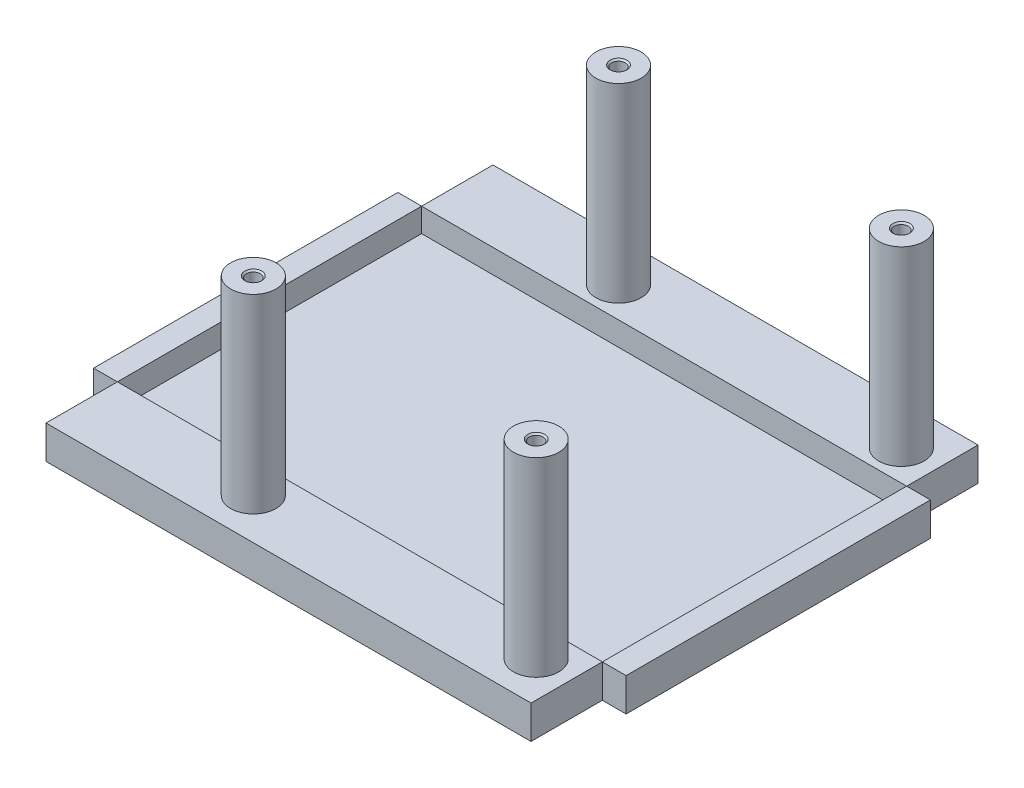
ISO-10303-21;
HEADER;
FILE_DESCRIPTION(('STEP AP214'),'2;1');
FILE_NAME('part.step','',(''),(''),'','','');
FILE_SCHEMA(('AUTOMOTIVE_DESIGN { 1 0 10303 214 1 1 1 1 }'));
ENDSEC;
DATA;
#1=APPLICATION_CONTEXT('core data for automotive mechanical design processes');
#2=APPLICATION_PROTOCOL_DEFINITION('international standard','automotive_design',2000,#1);
#3=PRODUCT_CONTEXT('',#1,'mechanical');
#4=PRODUCT('Part','Part','',(#3));
#5=PRODUCT_RELATED_PRODUCT_CATEGORY('part','',(#4));
#6=PRODUCT_DEFINITION_FORMATION('','',#4);
#7=PRODUCT_DEFINITION_CONTEXT('part definition',#1,'design');
#8=PRODUCT_DEFINITION('design','',#6,#7);
#9=PRODUCT_DEFINITION_SHAPE('','',#8);
#10=(LENGTH_UNIT() NAMED_UNIT(*) SI_UNIT(.MILLI.,.METRE.));
#11=(NAMED_UNIT(*) PLANE_ANGLE_UNIT() SI_UNIT($,.RADIAN.));
#12=(NAMED_UNIT(*) SI_UNIT($,.STERADIAN.) SOLID_ANGLE_UNIT());
#13=UNCERTAINTY_MEASURE_WITH_UNIT(LENGTH_MEASURE(1.E-05),#10,'distance_accuracy_value','');
#14=(GEOMETRIC_REPRESENTATION_CONTEXT(3) GLOBAL_UNCERTAINTY_ASSIGNED_CONTEXT((#13)) GLOBAL_UNIT_ASSIGNED_CONTEXT((#10,
#11,#12)) REPRESENTATION_CONTEXT('',''));
#15=CARTESIAN_POINT('',(0.,0.,0.));
#16=DIRECTION('',(0.,0.,1.));
#17=DIRECTION('',(1.,0.,0.));
#18=AXIS2_PLACEMENT_3D('',#15,#16,#17);
#19=CARTESIAN_POINT('',(0.,7.,-64.));
#20=DIRECTION('',(0.,0.,1.));
#21=DIRECTION('',(1.,0.,0.));
#22=AXIS2_PLACEMENT_3D('',#19,#20,#21);
#23=PLANE('',#22);
#24=DIRECTION('',(-1.,0.,0.));
#25=VECTOR('',#24,1.);
#26=CARTESIAN_POINT('',(0.,0.,-64.));
#27=LINE('',#26,#25);
#28=CARTESIAN_POINT('',(0.,0.,-64.));
#29=VERTEX_POINT('',#28);
#30=CARTESIAN_POINT('',(-5.00000000000001,0.,-64.));
#31=VERTEX_POINT('',#30);
#32=EDGE_CURVE('E247',#29,#31,#27,.T.);
#33=ORIENTED_EDGE('',*,*,#32,.T.);
#34=DIRECTION('',(0.,-1.,0.));
#35=VECTOR('',#34,1.);
#36=CARTESIAN_POINT('',(-5.00000000000001,7.,-64.));
#37=LINE('',#36,#35);
#38=CARTESIAN_POINT('',(-5.00000000000001,7.,-64.));
#39=VERTEX_POINT('',#38);
#40=EDGE_CURVE('E12',#39,#31,#37,.T.);
#41=ORIENTED_EDGE('',*,*,#40,.F.);
#42=DIRECTION('',(-1.,0.,0.));
#43=VECTOR('',#42,1.);
#44=CARTESIAN_POINT('',(0.,7.,-64.));
#45=LINE('',#44,#43);
#46=CARTESIAN_POINT('',(0.,7.,-64.));
#47=VERTEX_POINT('',#46);
#48=EDGE_CURVE('E274',#47,#39,#45,.T.);
#49=ORIENTED_EDGE('',*,*,#48,.F.);
#50=DIRECTION('',(0.,-1.,0.));
#51=VECTOR('',#50,1.);
#52=CARTESIAN_POINT('',(0.,7.,-64.));
#53=LINE('',#52,#51);
#54=EDGE_CURVE('E117',#47,#29,#53,.T.);
#55=ORIENTED_EDGE('',*,*,#54,.T.);
#56=EDGE_LOOP('',(#33,#41,#49,#55));
#57=FACE_BOUND('',#56,.T.);
#58=ADVANCED_FACE('F91',(#57),#23,.F.);
#59=CARTESIAN_POINT('',(-5.,7.,0.));
#60=DIRECTION('',(1.,0.,0.));
#61=DIRECTION('',(0.,0.,-1.));
#62=AXIS2_PLACEMENT_3D('',#59,#60,#61);
#63=PLANE('',#62);
#64=DIRECTION('',(0.,0.,1.));
#65=VECTOR('',#64,1.);
#66=CARTESIAN_POINT('',(-5.,0.,0.));
#67=LINE('',#66,#65);
#68=CARTESIAN_POINT('',(-5.,0.,0.));
#69=VERTEX_POINT('',#68);
#70=EDGE_CURVE('E275',#31,#69,#67,.T.);
#71=ORIENTED_EDGE('',*,*,#70,.T.);
#72=DIRECTION('',(0.,-1.,0.));
#73=VECTOR('',#72,1.);
#74=CARTESIAN_POINT('',(-5.,7.,0.));
#75=LINE('',#74,#73);
#76=CARTESIAN_POINT('',(-5.,7.,0.));
#77=VERTEX_POINT('',#76);
#78=EDGE_CURVE('E100',#77,#69,#75,.T.);
#79=ORIENTED_EDGE('',*,*,#78,.F.);
#80=DIRECTION('',(0.,0.,1.));
#81=VECTOR('',#80,1.);
#82=CARTESIAN_POINT('',(-5.,7.,0.));
#83=LINE('',#82,#81);
#84=EDGE_CURVE('E282',#39,#77,#83,.T.);
#85=ORIENTED_EDGE('',*,*,#84,.F.);
#86=ORIENTED_EDGE('',*,*,#40,.T.);
#87=EDGE_LOOP('',(#71,#79,#85,#86));
#88=FACE_BOUND('',#87,.T.);
#89=ADVANCED_FACE('F412',(#88),#63,.F.);
#90=CARTESIAN_POINT('',(0.,7.,0.));
#91=DIRECTION('',(0.,0.,1.));
#92=DIRECTION('',(1.,0.,0.));
#93=AXIS2_PLACEMENT_3D('',#90,#91,#92);
#94=PLANE('',#93);
#95=DIRECTION('',(-1.,0.,0.));
#96=VECTOR('',#95,1.);
#97=CARTESIAN_POINT('',(0.,0.,0.));
#98=LINE('',#97,#96);
#99=CARTESIAN_POINT('',(0.,0.,0.));
#100=VERTEX_POINT('',#99);
#101=EDGE_CURVE('E272',#100,#69,#98,.T.);
#102=ORIENTED_EDGE('',*,*,#101,.F.);
#103=DIRECTION('',(0.,-1.,0.));
#104=VECTOR('',#103,1.);
#105=CARTESIAN_POINT('',(0.,7.,0.));
#106=LINE('',#105,#104);
#107=CARTESIAN_POINT('',(0.,7.,0.));
#108=VERTEX_POINT('',#107);
#109=EDGE_CURVE('E200',#108,#100,#106,.T.);
#110=ORIENTED_EDGE('',*,*,#109,.F.);
#111=DIRECTION('',(-1.,0.,0.));
#112=VECTOR('',#111,1.);
#113=CARTESIAN_POINT('',(0.,7.,0.));
#114=LINE('',#113,#112);
#115=EDGE_CURVE('E271',#108,#77,#114,.T.);
#116=ORIENTED_EDGE('',*,*,#115,.T.);
#117=ORIENTED_EDGE('',*,*,#78,.T.);
#118=EDGE_LOOP('',(#102,#110,#116,#117));
#119=FACE_BOUND('',#118,.T.);
#120=ADVANCED_FACE('F396',(#119),#94,.T.);
#121=CARTESIAN_POINT('',(0.,7.,0.));
#122=DIRECTION('',(0.,1.,0.));
#123=DIRECTION('',(0.,0.,1.));
#124=AXIS2_PLACEMENT_3D('',#121,#122,#123);
#125=PLANE('',#124);
#126=CARTESIAN_POINT('',(35.,7.,6.4));
#127=DIRECTION('',(0.,1.,0.));
#128=DIRECTION('',(0.,0.,-1.));
#129=AXIS2_PLACEMENT_3D('',#126,#127,#128);
#130=CIRCLE('',#129,4.77);
#131=CARTESIAN_POINT('',(35.,7.,1.63000000000001));
#132=VERTEX_POINT('',#131);
#133=EDGE_CURVE('E332',#132,#132,#130,.T.);
#134=ORIENTED_EDGE('',*,*,#133,.F.);
#135=EDGE_LOOP('',(#134));
#136=FACE_BOUND('',#135,.T.);
#137=CARTESIAN_POINT('',(94.4848413744065,7.,6.4));
#138=DIRECTION('',(0.,1.,0.));
#139=DIRECTION('',(0.,0.,-1.));
#140=AXIS2_PLACEMENT_3D('',#137,#138,#139);
#141=CIRCLE('',#140,4.76999999999998);
#142=CARTESIAN_POINT('',(94.4848413744065,7.,1.63000000000002));
#143=VERTEX_POINT('',#142);
#144=EDGE_CURVE('E326',#143,#143,#141,.T.);
#145=ORIENTED_EDGE('',*,*,#144,.F.);
#146=EDGE_LOOP('',(#145));
#147=FACE_BOUND('',#146,.T.);
#148=CARTESIAN_POINT('',(94.4848413744066,7.,-70.4));
#149=DIRECTION('',(0.,1.,0.));
#150=DIRECTION('',(0.,0.,1.));
#151=AXIS2_PLACEMENT_3D('',#148,#149,#150);
#152=CIRCLE('',#151,4.76999999999998);
#153=CARTESIAN_POINT('',(94.4848413744066,7.,-65.63));
#154=VERTEX_POINT('',#153);
#155=EDGE_CURVE('E320',#154,#154,#152,.T.);
#156=ORIENTED_EDGE('',*,*,#155,.F.);
#157=EDGE_LOOP('',(#156));
#158=FACE_BOUND('',#157,.T.);
#159=CARTESIAN_POINT('',(35.,7.,-70.4));
#160=DIRECTION('',(0.,1.,0.));
#161=DIRECTION('',(0.,0.,1.));
#162=AXIS2_PLACEMENT_3D('',#159,#160,#161);
#163=CIRCLE('',#162,4.77);
#164=CARTESIAN_POINT('',(35.,7.,-65.63));
#165=VERTEX_POINT('',#164);
#166=EDGE_CURVE('E317',#165,#165,#163,.T.);
#167=ORIENTED_EDGE('',*,*,#166,.F.);
#168=EDGE_LOOP('',(#167));
#169=FACE_BOUND('',#168,.T.);
#170=DIRECTION('',(1.,0.,0.));
#171=VECTOR('',#170,1.);
#172=CARTESIAN_POINT('',(102.,7.,-0.0100000000000225));
#173=LINE('',#172,#171);
#174=CARTESIAN_POINT('',(0.,7.,-0.01000000000001));
#175=VERTEX_POINT('',#174);
#176=CARTESIAN_POINT('',(102.,7.,-0.0100000000000225));
#177=VERTEX_POINT('',#176);
#178=EDGE_CURVE('E108',#175,#177,#173,.T.);
#179=ORIENTED_EDGE('',*,*,#178,.F.);
#180=DIRECTION('',(0.,0.,1.));
#181=VECTOR('',#180,1.);
#182=CARTESIAN_POINT('',(0.,7.,-0.01000000000001));
#183=LINE('',#182,#181);
#184=CARTESIAN_POINT('',(0.,7.,-63.99));
#185=VERTEX_POINT('',#184);
#186=EDGE_CURVE('E295',#185,#175,#183,.T.);
#187=ORIENTED_EDGE('',*,*,#186,.F.);
#188=DIRECTION('',(-1.,0.,0.));
#189=VECTOR('',#188,1.);
#190=CARTESIAN_POINT('',(0.,7.,-63.99));
#191=LINE('',#190,#189);
#192=CARTESIAN_POINT('',(102.,7.,-63.99));
#193=VERTEX_POINT('',#192);
#194=EDGE_CURVE('E299',#193,#185,#191,.T.);
#195=ORIENTED_EDGE('',*,*,#194,.F.);
#196=DIRECTION('',(0.,0.,-1.));
#197=VECTOR('',#196,1.);
#198=CARTESIAN_POINT('',(102.,7.,-63.99));
#199=LINE('',#198,#197);
#200=EDGE_CURVE('E302',#177,#193,#199,.T.);
#201=ORIENTED_EDGE('',*,*,#200,.F.);
#202=EDGE_LOOP('',(#179,#187,#195,#201));
#203=FACE_BOUND('',#202,.T.);
#204=ORIENTED_EDGE('',*,*,#48,.T.);
#205=ORIENTED_EDGE('',*,*,#84,.T.);
#206=ORIENTED_EDGE('',*,*,#115,.F.);
#207=DIRECTION('',(0.,0.,1.));
#208=VECTOR('',#207,1.);
#209=CARTESIAN_POINT('',(0.,7.,0.));
#210=LINE('',#209,#208);
#211=CARTESIAN_POINT('',(0.,7.,15.));
#212=VERTEX_POINT('',#211);
#213=EDGE_CURVE('E196',#108,#212,#210,.T.);
#214=ORIENTED_EDGE('',*,*,#213,.T.);
#215=DIRECTION('',(-1.,0.,0.));
#216=VECTOR('',#215,1.);
#217=CARTESIAN_POINT('',(0.,7.,15.));
#218=LINE('',#217,#216);
#219=CARTESIAN_POINT('',(102.,7.,15.));
#220=VERTEX_POINT('',#219);
#221=EDGE_CURVE('E193',#220,#212,#218,.T.);
#222=ORIENTED_EDGE('',*,*,#221,.F.);
#223=DIRECTION('',(0.,0.,1.));
#224=VECTOR('',#223,1.);
#225=CARTESIAN_POINT('',(102.,7.,0.));
#226=LINE('',#225,#224);
#227=CARTESIAN_POINT('',(102.,7.,0.));
#228=VERTEX_POINT('',#227);
#229=EDGE_CURVE('E217',#228,#220,#226,.T.);
#230=ORIENTED_EDGE('',*,*,#229,.F.);
#231=DIRECTION('',(1.,0.,0.));
#232=VECTOR('',#231,1.);
#233=CARTESIAN_POINT('',(0.,7.,0.));
#234=LINE('',#233,#232);
#235=CARTESIAN_POINT('',(107.,7.,0.));
#236=VERTEX_POINT('',#235);
#237=EDGE_CURVE('E228',#228,#236,#234,.T.);
#238=ORIENTED_EDGE('',*,*,#237,.T.);
#239=DIRECTION('',(0.,0.,1.));
#240=VECTOR('',#239,1.);
#241=CARTESIAN_POINT('',(107.,7.,0.));
#242=LINE('',#241,#240);
#243=CARTESIAN_POINT('',(107.,7.,-64.));
#244=VERTEX_POINT('',#243);
#245=EDGE_CURVE('E232',#244,#236,#242,.T.);
#246=ORIENTED_EDGE('',*,*,#245,.F.);
#247=DIRECTION('',(1.,0.,0.));
#248=VECTOR('',#247,1.);
#249=CARTESIAN_POINT('',(0.,7.,-64.));
#250=LINE('',#249,#248);
#251=CARTESIAN_POINT('',(102.,7.,-64.));
#252=VERTEX_POINT('',#251);
#253=EDGE_CURVE('E240',#252,#244,#250,.T.);
#254=ORIENTED_EDGE('',*,*,#253,.F.);
#255=DIRECTION('',(0.,0.,1.));
#256=VECTOR('',#255,1.);
#257=CARTESIAN_POINT('',(102.,7.,0.));
#258=LINE('',#257,#256);
#259=CARTESIAN_POINT('',(102.,7.,-79.));
#260=VERTEX_POINT('',#259);
#261=EDGE_CURVE('E256',#260,#252,#258,.T.);
#262=ORIENTED_EDGE('',*,*,#261,.F.);
#263=DIRECTION('',(1.,0.,0.));
#264=VECTOR('',#263,1.);
#265=CARTESIAN_POINT('',(0.,7.,-79.));
#266=LINE('',#265,#264);
#267=CARTESIAN_POINT('',(0.,7.,-79.));
#268=VERTEX_POINT('',#267);
#269=EDGE_CURVE('E263',#268,#260,#266,.T.);
#270=ORIENTED_EDGE('',*,*,#269,.F.);
#271=DIRECTION('',(0.,0.,-1.));
#272=VECTOR('',#271,1.);
#273=CARTESIAN_POINT('',(0.,7.,0.));
#274=LINE('',#273,#272);
#275=EDGE_CURVE('E252',#47,#268,#274,.T.);
#276=ORIENTED_EDGE('',*,*,#275,.F.);
#277=EDGE_LOOP('',(#204,#205,#206,#214,#222,#230,#238,#246,#254,#262,#270,#276));
#278=FACE_BOUND('',#277,.T.);
#279=ADVANCED_FACE('F393',(#136,#147,#158,#169,#203,#278),#125,.T.);
#280=CARTESIAN_POINT('',(0.,0.,0.));
#281=DIRECTION('',(0.,1.,0.));
#282=DIRECTION('',(0.,0.,1.));
#283=AXIS2_PLACEMENT_3D('',#280,#281,#282);
#284=PLANE('',#283);
#285=ORIENTED_EDGE('',*,*,#32,.F.);
#286=DIRECTION('',(0.,0.,-1.));
#287=VECTOR('',#286,1.);
#288=CARTESIAN_POINT('',(0.,0.,0.));
#289=LINE('',#288,#287);
#290=CARTESIAN_POINT('',(0.,0.,-79.));
#291=VERTEX_POINT('',#290);
#292=EDGE_CURVE('E253',#29,#291,#289,.T.);
#293=ORIENTED_EDGE('',*,*,#292,.T.);
#294=DIRECTION('',(1.,0.,0.));
#295=VECTOR('',#294,1.);
#296=CARTESIAN_POINT('',(0.,0.,-79.));
#297=LINE('',#296,#295);
#298=CARTESIAN_POINT('',(102.,0.,-79.));
#299=VERTEX_POINT('',#298);
#300=EDGE_CURVE('E257',#291,#299,#297,.T.);
#301=ORIENTED_EDGE('',*,*,#300,.T.);
#302=DIRECTION('',(0.,0.,1.));
#303=VECTOR('',#302,1.);
#304=CARTESIAN_POINT('',(102.,0.,0.));
#305=LINE('',#304,#303);
#306=CARTESIAN_POINT('',(102.,0.,-64.));
#307=VERTEX_POINT('',#306);
#308=EDGE_CURVE('E223',#299,#307,#305,.T.);
#309=ORIENTED_EDGE('',*,*,#308,.T.);
#310=DIRECTION('',(1.,0.,0.));
#311=VECTOR('',#310,1.);
#312=CARTESIAN_POINT('',(0.,0.,-64.));
#313=LINE('',#312,#311);
#314=CARTESIAN_POINT('',(107.,0.,-64.));
#315=VERTEX_POINT('',#314);
#316=EDGE_CURVE('E233',#307,#315,#313,.T.);
#317=ORIENTED_EDGE('',*,*,#316,.T.);
#318=DIRECTION('',(0.,0.,1.));
#319=VECTOR('',#318,1.);
#320=CARTESIAN_POINT('',(107.,0.,0.));
#321=LINE('',#320,#319);
#322=CARTESIAN_POINT('',(107.,0.,0.));
#323=VERTEX_POINT('',#322);
#324=EDGE_CURVE('E236',#315,#323,#321,.T.);
#325=ORIENTED_EDGE('',*,*,#324,.T.);
#326=DIRECTION('',(1.,0.,0.));
#327=VECTOR('',#326,1.);
#328=CARTESIAN_POINT('',(0.,0.,0.));
#329=LINE('',#328,#327);
#330=CARTESIAN_POINT('',(102.,0.,0.));
#331=VERTEX_POINT('',#330);
#332=EDGE_CURVE('E229',#331,#323,#329,.T.);
#333=ORIENTED_EDGE('',*,*,#332,.F.);
#334=DIRECTION('',(0.,0.,1.));
#335=VECTOR('',#334,1.);
#336=CARTESIAN_POINT('',(102.,0.,0.));
#337=LINE('',#336,#335);
#338=CARTESIAN_POINT('',(102.,0.,15.));
#339=VERTEX_POINT('',#338);
#340=EDGE_CURVE('E204',#331,#339,#337,.T.);
#341=ORIENTED_EDGE('',*,*,#340,.T.);
#342=DIRECTION('',(-1.,0.,0.));
#343=VECTOR('',#342,1.);
#344=CARTESIAN_POINT('',(0.,0.,15.));
#345=LINE('',#344,#343);
#346=CARTESIAN_POINT('',(0.,0.,15.));
#347=VERTEX_POINT('',#346);
#348=EDGE_CURVE('E190',#339,#347,#345,.T.);
#349=ORIENTED_EDGE('',*,*,#348,.T.);
#350=DIRECTION('',(0.,0.,1.));
#351=VECTOR('',#350,1.);
#352=CARTESIAN_POINT('',(0.,0.,0.));
#353=LINE('',#352,#351);
#354=EDGE_CURVE('E198',#100,#347,#353,.T.);
#355=ORIENTED_EDGE('',*,*,#354,.F.);
#356=ORIENTED_EDGE('',*,*,#101,.T.);
#357=ORIENTED_EDGE('',*,*,#70,.F.);
#358=EDGE_LOOP('',(#285,#293,#301,#309,#317,#325,#333,#341,#349,#355,#356,#357));
#359=FACE_BOUND('',#358,.T.);
#360=ADVANCED_FACE('F207',(#359),#284,.F.);
#361=CARTESIAN_POINT('',(0.,7.,-64.));
#362=DIRECTION('',(0.,0.,-1.));
#363=DIRECTION('',(-1.,0.,0.));
#364=AXIS2_PLACEMENT_3D('',#361,#362,#363);
#365=PLANE('',#364);
#366=ORIENTED_EDGE('',*,*,#316,.F.);
#367=DIRECTION('',(0.,-1.,0.));
#368=VECTOR('',#367,1.);
#369=CARTESIAN_POINT('',(102.,7.,-64.));
#370=LINE('',#369,#368);
#371=EDGE_CURVE('E250',#252,#307,#370,.T.);
#372=ORIENTED_EDGE('',*,*,#371,.F.);
#373=ORIENTED_EDGE('',*,*,#253,.T.);
#374=DIRECTION('',(0.,-1.,0.));
#375=VECTOR('',#374,1.);
#376=CARTESIAN_POINT('',(107.,7.,-64.));
#377=LINE('',#376,#375);
#378=EDGE_CURVE('E221',#244,#315,#377,.T.);
#379=ORIENTED_EDGE('',*,*,#378,.T.);
#380=EDGE_LOOP('',(#366,#372,#373,#379));
#381=FACE_BOUND('',#380,.T.);
#382=ADVANCED_FACE('F427',(#381),#365,.T.);
#383=CARTESIAN_POINT('',(0.,7.,0.));
#384=DIRECTION('',(0.,0.,-1.));
#385=DIRECTION('',(-1.,0.,0.));
#386=AXIS2_PLACEMENT_3D('',#383,#384,#385);
#387=PLANE('',#386);
#388=ORIENTED_EDGE('',*,*,#332,.T.);
#389=DIRECTION('',(0.,-1.,0.));
#390=VECTOR('',#389,1.);
#391=CARTESIAN_POINT('',(107.,7.,0.));
#392=LINE('',#391,#390);
#393=EDGE_CURVE('E226',#236,#323,#392,.T.);
#394=ORIENTED_EDGE('',*,*,#393,.F.);
#395=ORIENTED_EDGE('',*,*,#237,.F.);
#396=DIRECTION('',(0.,-1.,0.));
#397=VECTOR('',#396,1.);
#398=CARTESIAN_POINT('',(102.,7.,0.));
#399=LINE('',#398,#397);
#400=EDGE_CURVE('E224',#228,#331,#399,.T.);
#401=ORIENTED_EDGE('',*,*,#400,.T.);
#402=EDGE_LOOP('',(#388,#394,#395,#401));
#403=FACE_BOUND('',#402,.T.);
#404=ADVANCED_FACE('F419',(#403),#387,.F.);
#405=CARTESIAN_POINT('',(107.,7.,0.));
#406=DIRECTION('',(1.,0.,0.));
#407=DIRECTION('',(0.,0.,-1.));
#408=AXIS2_PLACEMENT_3D('',#405,#406,#407);
#409=PLANE('',#408);
#410=ORIENTED_EDGE('',*,*,#324,.F.);
#411=ORIENTED_EDGE('',*,*,#378,.F.);
#412=ORIENTED_EDGE('',*,*,#245,.T.);
#413=ORIENTED_EDGE('',*,*,#393,.T.);
#414=EDGE_LOOP('',(#410,#411,#412,#413));
#415=FACE_BOUND('',#414,.T.);
#416=ADVANCED_FACE('F436',(#415),#409,.T.);
#417=CARTESIAN_POINT('',(102.,7.,0.));
#418=DIRECTION('',(1.,0.,0.));
#419=DIRECTION('',(0.,0.,-1.));
#420=AXIS2_PLACEMENT_3D('',#417,#418,#419);
#421=PLANE('',#420);
#422=ORIENTED_EDGE('',*,*,#308,.F.);
#423=DIRECTION('',(0.,-1.,0.));
#424=VECTOR('',#423,1.);
#425=CARTESIAN_POINT('',(102.,7.,-79.));
#426=LINE('',#425,#424);
#427=EDGE_CURVE('E245',#260,#299,#426,.T.);
#428=ORIENTED_EDGE('',*,*,#427,.F.);
#429=ORIENTED_EDGE('',*,*,#261,.T.);
#430=ORIENTED_EDGE('',*,*,#371,.T.);
#431=EDGE_LOOP('',(#422,#428,#429,#430));
#432=FACE_BOUND('',#431,.T.);
#433=ADVANCED_FACE('F431',(#432),#421,.T.);
#434=CARTESIAN_POINT('',(102.,7.,0.));
#435=DIRECTION('',(1.,0.,0.));
#436=DIRECTION('',(0.,0.,-1.));
#437=AXIS2_PLACEMENT_3D('',#434,#435,#436);
#438=PLANE('',#437);
#439=ORIENTED_EDGE('',*,*,#340,.F.);
#440=ORIENTED_EDGE('',*,*,#400,.F.);
#441=ORIENTED_EDGE('',*,*,#229,.T.);
#442=DIRECTION('',(0.,-1.,0.));
#443=VECTOR('',#442,1.);
#444=CARTESIAN_POINT('',(102.,7.,15.));
#445=LINE('',#444,#443);
#446=EDGE_CURVE('E95',#220,#339,#445,.T.);
#447=ORIENTED_EDGE('',*,*,#446,.T.);
#448=EDGE_LOOP('',(#439,#440,#441,#447));
#449=FACE_BOUND('',#448,.T.);
#450=ADVANCED_FACE('F417',(#449),#438,.T.);
#451=CARTESIAN_POINT('',(0.,7.,-79.));
#452=DIRECTION('',(0.,0.,-1.));
#453=DIRECTION('',(-1.,0.,0.));
#454=AXIS2_PLACEMENT_3D('',#451,#452,#453);
#455=PLANE('',#454);
#456=ORIENTED_EDGE('',*,*,#300,.F.);
#457=DIRECTION('',(0.,-1.,0.));
#458=VECTOR('',#457,1.);
#459=CARTESIAN_POINT('',(0.,7.,-79.));
#460=LINE('',#459,#458);
#461=EDGE_CURVE('E248',#268,#291,#460,.T.);
#462=ORIENTED_EDGE('',*,*,#461,.F.);
#463=ORIENTED_EDGE('',*,*,#269,.T.);
#464=ORIENTED_EDGE('',*,*,#427,.T.);
#465=EDGE_LOOP('',(#456,#462,#463,#464));
#466=FACE_BOUND('',#465,.T.);
#467=ADVANCED_FACE('F434',(#466),#455,.T.);
#468=CARTESIAN_POINT('',(0.,7.,15.));
#469=DIRECTION('',(0.,0.,1.));
#470=DIRECTION('',(1.,0.,0.));
#471=AXIS2_PLACEMENT_3D('',#468,#469,#470);
#472=PLANE('',#471);
#473=ORIENTED_EDGE('',*,*,#348,.F.);
#474=ORIENTED_EDGE('',*,*,#446,.F.);
#475=ORIENTED_EDGE('',*,*,#221,.T.);
#476=DIRECTION('',(0.,-1.,0.));
#477=VECTOR('',#476,1.);
#478=CARTESIAN_POINT('',(0.,7.,15.));
#479=LINE('',#478,#477);
#480=EDGE_CURVE('E187',#212,#347,#479,.T.);
#481=ORIENTED_EDGE('',*,*,#480,.T.);
#482=EDGE_LOOP('',(#473,#474,#475,#481));
#483=FACE_BOUND('',#482,.T.);
#484=ADVANCED_FACE('F93',(#483),#472,.T.);
#485=CARTESIAN_POINT('',(0.,7.,0.));
#486=DIRECTION('',(1.,0.,0.));
#487=DIRECTION('',(0.,0.,-1.));
#488=AXIS2_PLACEMENT_3D('',#485,#486,#487);
#489=PLANE('',#488);
#490=ORIENTED_EDGE('',*,*,#354,.T.);
#491=ORIENTED_EDGE('',*,*,#480,.F.);
#492=ORIENTED_EDGE('',*,*,#213,.F.);
#493=ORIENTED_EDGE('',*,*,#109,.T.);
#494=EDGE_LOOP('',(#490,#491,#492,#493));
#495=FACE_BOUND('',#494,.T.);
#496=ADVANCED_FACE('F199',(#495),#489,.F.);
#497=CARTESIAN_POINT('',(0.,7.,0.));
#498=DIRECTION('',(-1.,0.,0.));
#499=DIRECTION('',(0.,0.,1.));
#500=AXIS2_PLACEMENT_3D('',#497,#498,#499);
#501=PLANE('',#500);
#502=ORIENTED_EDGE('',*,*,#292,.F.);
#503=ORIENTED_EDGE('',*,*,#54,.F.);
#504=ORIENTED_EDGE('',*,*,#275,.T.);
#505=ORIENTED_EDGE('',*,*,#461,.T.);
#506=EDGE_LOOP('',(#502,#503,#504,#505));
#507=FACE_BOUND('',#506,.T.);
#508=ADVANCED_FACE('F435',(#507),#501,.T.);
#509=CARTESIAN_POINT('',(102.,2.,-0.0100000000000225));
#510=DIRECTION('',(0.,0.,1.));
#511=DIRECTION('',(1.,0.,0.));
#512=AXIS2_PLACEMENT_3D('',#509,#510,#511);
#513=PLANE('',#512);
#514=ORIENTED_EDGE('',*,*,#178,.T.);
#515=DIRECTION('',(0.,1.,0.));
#516=VECTOR('',#515,1.);
#517=CARTESIAN_POINT('',(102.,2.,-0.0100000000000225));
#518=LINE('',#517,#516);
#519=CARTESIAN_POINT('',(102.,2.,-0.0100000000000225));
#520=VERTEX_POINT('',#519);
#521=EDGE_CURVE('E287',#520,#177,#518,.T.);
#522=ORIENTED_EDGE('',*,*,#521,.F.);
#523=DIRECTION('',(1.,0.,0.));
#524=VECTOR('',#523,1.);
#525=CARTESIAN_POINT('',(102.,2.,-0.0100000000000225));
#526=LINE('',#525,#524);
#527=CARTESIAN_POINT('',(0.,2.,-0.01000000000001));
#528=VERTEX_POINT('',#527);
#529=EDGE_CURVE('E298',#528,#520,#526,.T.);
#530=ORIENTED_EDGE('',*,*,#529,.F.);
#531=DIRECTION('',(0.,1.,0.));
#532=VECTOR('',#531,1.);
#533=CARTESIAN_POINT('',(0.,2.,-0.01000000000001));
#534=LINE('',#533,#532);
#535=EDGE_CURVE('E210',#528,#175,#534,.T.);
#536=ORIENTED_EDGE('',*,*,#535,.T.);
#537=EDGE_LOOP('',(#514,#522,#530,#536));
#538=FACE_BOUND('',#537,.T.);
#539=ADVANCED_FACE('F453',(#538),#513,.F.);
#540=CARTESIAN_POINT('',(0.,2.,-0.01000000000001));
#541=DIRECTION('',(-1.,0.,0.));
#542=DIRECTION('',(0.,0.,1.));
#543=AXIS2_PLACEMENT_3D('',#540,#541,#542);
#544=PLANE('',#543);
#545=ORIENTED_EDGE('',*,*,#186,.T.);
#546=ORIENTED_EDGE('',*,*,#535,.F.);
#547=DIRECTION('',(0.,0.,1.));
#548=VECTOR('',#547,1.);
#549=CARTESIAN_POINT('',(0.,2.,-0.01000000000001));
#550=LINE('',#549,#548);
#551=CARTESIAN_POINT('',(0.,2.,-63.99));
#552=VERTEX_POINT('',#551);
#553=EDGE_CURVE('E290',#552,#528,#550,.T.);
#554=ORIENTED_EDGE('',*,*,#553,.F.);
#555=DIRECTION('',(0.,1.,0.));
#556=VECTOR('',#555,1.);
#557=CARTESIAN_POINT('',(0.,2.,-63.99));
#558=LINE('',#557,#556);
#559=EDGE_CURVE('E213',#552,#185,#558,.T.);
#560=ORIENTED_EDGE('',*,*,#559,.T.);
#561=EDGE_LOOP('',(#545,#546,#554,#560));
#562=FACE_BOUND('',#561,.T.);
#563=ADVANCED_FACE('F467',(#562),#544,.F.);
#564=CARTESIAN_POINT('',(0.,2.,-63.99));
#565=DIRECTION('',(0.,0.,-1.));
#566=DIRECTION('',(-1.,0.,0.));
#567=AXIS2_PLACEMENT_3D('',#564,#565,#566);
#568=PLANE('',#567);
#569=ORIENTED_EDGE('',*,*,#194,.T.);
#570=ORIENTED_EDGE('',*,*,#559,.F.);
#571=DIRECTION('',(-1.,0.,0.));
#572=VECTOR('',#571,1.);
#573=CARTESIAN_POINT('',(0.,2.,-63.99));
#574=LINE('',#573,#572);
#575=CARTESIAN_POINT('',(102.,2.,-63.99));
#576=VERTEX_POINT('',#575);
#577=EDGE_CURVE('E309',#576,#552,#574,.T.);
#578=ORIENTED_EDGE('',*,*,#577,.F.);
#579=DIRECTION('',(0.,1.,0.));
#580=VECTOR('',#579,1.);
#581=CARTESIAN_POINT('',(102.,2.,-63.99));
#582=LINE('',#581,#580);
#583=EDGE_CURVE('E289',#576,#193,#582,.T.);
#584=ORIENTED_EDGE('',*,*,#583,.T.);
#585=EDGE_LOOP('',(#569,#570,#578,#584));
#586=FACE_BOUND('',#585,.T.);
#587=ADVANCED_FACE('F471',(#586),#568,.F.);
#588=CARTESIAN_POINT('',(102.,2.,-63.99));
#589=DIRECTION('',(1.,0.,0.));
#590=DIRECTION('',(0.,0.,-1.));
#591=AXIS2_PLACEMENT_3D('',#588,#589,#590);
#592=PLANE('',#591);
#593=ORIENTED_EDGE('',*,*,#200,.T.);
#594=ORIENTED_EDGE('',*,*,#583,.F.);
#595=DIRECTION('',(0.,0.,-1.));
#596=VECTOR('',#595,1.);
#597=CARTESIAN_POINT('',(102.,2.,-63.99));
#598=LINE('',#597,#596);
#599=EDGE_CURVE('E312',#520,#576,#598,.T.);
#600=ORIENTED_EDGE('',*,*,#599,.F.);
#601=ORIENTED_EDGE('',*,*,#521,.T.);
#602=EDGE_LOOP('',(#593,#594,#600,#601));
#603=FACE_BOUND('',#602,.T.);
#604=ADVANCED_FACE('F468',(#603),#592,.F.);
#605=CARTESIAN_POINT('',(0.,2.,0.));
#606=DIRECTION('',(0.,-1.,0.));
#607=DIRECTION('',(0.,0.,-1.));
#608=AXIS2_PLACEMENT_3D('',#605,#606,#607);
#609=PLANE('',#608);
#610=ORIENTED_EDGE('',*,*,#529,.T.);
#611=ORIENTED_EDGE('',*,*,#599,.T.);
#612=ORIENTED_EDGE('',*,*,#577,.T.);
#613=ORIENTED_EDGE('',*,*,#553,.T.);
#614=EDGE_LOOP('',(#610,#611,#612,#613));
#615=FACE_BOUND('',#614,.T.);
#616=ADVANCED_FACE('F389',(#615),#609,.F.);
#617=CARTESIAN_POINT('',(35.,47.,-70.4));
#618=DIRECTION('',(0.,-1.,0.));
#619=DIRECTION('',(0.,0.,-1.));
#620=AXIS2_PLACEMENT_3D('',#617,#618,#619);
#621=CYLINDRICAL_SURFACE('',#620,4.77);
#622=CARTESIAN_POINT('',(35.,47.,-70.4));
#623=DIRECTION('',(0.,1.,0.));
#624=DIRECTION('',(0.,0.,1.));
#625=AXIS2_PLACEMENT_3D('',#622,#623,#624);
#626=CIRCLE('',#625,4.77);
#627=CARTESIAN_POINT('',(35.,47.,-65.63));
#628=VERTEX_POINT('',#627);
#629=EDGE_CURVE('E306',#628,#628,#626,.T.);
#630=ORIENTED_EDGE('',*,*,#629,.F.);
#631=EDGE_LOOP('',(#630));
#632=FACE_BOUND('',#631,.T.);
#633=ORIENTED_EDGE('',*,*,#166,.T.);
#634=EDGE_LOOP('',(#633));
#635=FACE_BOUND('',#634,.T.);
#636=ADVANCED_FACE('F383',(#632,#635),#621,.T.);
#637=CARTESIAN_POINT('',(35.,47.,-70.4));
#638=DIRECTION('',(0.,1.,0.));
#639=DIRECTION('',(0.,0.,1.));
#640=AXIS2_PLACEMENT_3D('',#637,#638,#639);
#641=PLANE('',#640);
#642=CARTESIAN_POINT('',(35.,47.,-70.4));
#643=DIRECTION('',(0.,1.,0.));
#644=DIRECTION('',(0.,0.,1.));
#645=AXIS2_PLACEMENT_3D('',#642,#643,#644);
#646=CIRCLE('',#645,1.775);
#647=CARTESIAN_POINT('',(35.,47.,-68.625));
#648=VERTEX_POINT('',#647);
#649=EDGE_CURVE('E373',#648,#648,#646,.T.);
#650=ORIENTED_EDGE('',*,*,#649,.F.);
#651=EDGE_LOOP('',(#650));
#652=FACE_BOUND('',#651,.T.);
#653=ORIENTED_EDGE('',*,*,#629,.T.);
#654=EDGE_LOOP('',(#653));
#655=FACE_BOUND('',#654,.T.);
#656=ADVANCED_FACE('F379',(#652,#655),#641,.T.);
#657=CARTESIAN_POINT('',(94.4848413744066,47.,-70.4));
#658=DIRECTION('',(0.,-1.,0.));
#659=DIRECTION('',(0.,0.,-1.));
#660=AXIS2_PLACEMENT_3D('',#657,#658,#659);
#661=CYLINDRICAL_SURFACE('',#660,4.76999999999998);
#662=CARTESIAN_POINT('',(94.4848413744066,47.,-70.4));
#663=DIRECTION('',(0.,1.,0.));
#664=DIRECTION('',(0.,0.,1.));
#665=AXIS2_PLACEMENT_3D('',#662,#663,#664);
#666=CIRCLE('',#665,4.76999999999998);
#667=CARTESIAN_POINT('',(94.4848413744066,47.,-65.63));
#668=VERTEX_POINT('',#667);
#669=EDGE_CURVE('E323',#668,#668,#666,.T.);
#670=ORIENTED_EDGE('',*,*,#669,.F.);
#671=EDGE_LOOP('',(#670));
#672=FACE_BOUND('',#671,.T.);
#673=ORIENTED_EDGE('',*,*,#155,.T.);
#674=EDGE_LOOP('',(#673));
#675=FACE_BOUND('',#674,.T.);
#676=ADVANCED_FACE('F382',(#672,#675),#661,.T.);
#677=CARTESIAN_POINT('',(94.4848413744066,47.,-70.4));
#678=DIRECTION('',(0.,1.,0.));
#679=DIRECTION('',(0.,0.,1.));
#680=AXIS2_PLACEMENT_3D('',#677,#678,#679);
#681=PLANE('',#680);
#682=CARTESIAN_POINT('',(94.4848413744066,47.,-70.4));
#683=DIRECTION('',(0.,1.,0.));
#684=DIRECTION('',(0.,0.,1.));
#685=AXIS2_PLACEMENT_3D('',#682,#683,#684);
#686=CIRCLE('',#685,1.775);
#687=CARTESIAN_POINT('',(94.4848413744066,47.,-68.625));
#688=VERTEX_POINT('',#687);
#689=EDGE_CURVE('E364',#688,#688,#686,.T.);
#690=ORIENTED_EDGE('',*,*,#689,.F.);
#691=EDGE_LOOP('',(#690));
#692=FACE_BOUND('',#691,.T.);
#693=ORIENTED_EDGE('',*,*,#669,.T.);
#694=EDGE_LOOP('',(#693));
#695=FACE_BOUND('',#694,.T.);
#696=ADVANCED_FACE('F482',(#692,#695),#681,.T.);
#697=CARTESIAN_POINT('',(94.4848413744065,47.,6.4));
#698=DIRECTION('',(0.,-1.,0.));
#699=DIRECTION('',(0.,0.,-1.));
#700=AXIS2_PLACEMENT_3D('',#697,#698,#699);
#701=CYLINDRICAL_SURFACE('',#700,4.76999999999998);
#702=CARTESIAN_POINT('',(94.4848413744065,47.,6.4));
#703=DIRECTION('',(0.,1.,0.));
#704=DIRECTION('',(0.,0.,-1.));
#705=AXIS2_PLACEMENT_3D('',#702,#703,#704);
#706=CIRCLE('',#705,4.76999999999998);
#707=CARTESIAN_POINT('',(94.4848413744065,47.,1.63000000000002));
#708=VERTEX_POINT('',#707);
#709=EDGE_CURVE('E329',#708,#708,#706,.T.);
#710=ORIENTED_EDGE('',*,*,#709,.F.);
#711=EDGE_LOOP('',(#710));
#712=FACE_BOUND('',#711,.T.);
#713=ORIENTED_EDGE('',*,*,#144,.T.);
#714=EDGE_LOOP('',(#713));
#715=FACE_BOUND('',#714,.T.);
#716=ADVANCED_FACE('F485',(#712,#715),#701,.T.);
#717=CARTESIAN_POINT('',(94.4848413744065,47.,6.4));
#718=DIRECTION('',(0.,-1.,0.));
#719=DIRECTION('',(0.,0.,-1.));
#720=AXIS2_PLACEMENT_3D('',#717,#718,#719);
#721=PLANE('',#720);
#722=CARTESIAN_POINT('',(94.4848413744065,47.,6.4));
#723=DIRECTION('',(0.,1.,0.));
#724=DIRECTION('',(0.,0.,1.));
#725=AXIS2_PLACEMENT_3D('',#722,#723,#724);
#726=CIRCLE('',#725,1.775);
#727=CARTESIAN_POINT('',(94.4848413744065,47.,8.175));
#728=VERTEX_POINT('',#727);
#729=EDGE_CURVE('E355',#728,#728,#726,.T.);
#730=ORIENTED_EDGE('',*,*,#729,.F.);
#731=EDGE_LOOP('',(#730));
#732=FACE_BOUND('',#731,.T.);
#733=ORIENTED_EDGE('',*,*,#709,.T.);
#734=EDGE_LOOP('',(#733));
#735=FACE_BOUND('',#734,.T.);
#736=ADVANCED_FACE('F490',(#732,#735),#721,.F.);
#737=CARTESIAN_POINT('',(35.,47.,6.4));
#738=DIRECTION('',(0.,-1.,0.));
#739=DIRECTION('',(0.,0.,-1.));
#740=AXIS2_PLACEMENT_3D('',#737,#738,#739);
#741=CYLINDRICAL_SURFACE('',#740,4.77);
#742=CARTESIAN_POINT('',(35.,47.,6.4));
#743=DIRECTION('',(0.,1.,0.));
#744=DIRECTION('',(0.,0.,-1.));
#745=AXIS2_PLACEMENT_3D('',#742,#743,#744);
#746=CIRCLE('',#745,4.77);
#747=CARTESIAN_POINT('',(35.,47.,1.63000000000001));
#748=VERTEX_POINT('',#747);
#749=EDGE_CURVE('E335',#748,#748,#746,.T.);
#750=ORIENTED_EDGE('',*,*,#749,.F.);
#751=EDGE_LOOP('',(#750));
#752=FACE_BOUND('',#751,.T.);
#753=ORIENTED_EDGE('',*,*,#133,.T.);
#754=EDGE_LOOP('',(#753));
#755=FACE_BOUND('',#754,.T.);
#756=ADVANCED_FACE('F493',(#752,#755),#741,.T.);
#757=CARTESIAN_POINT('',(35.,47.,6.4));
#758=DIRECTION('',(0.,-1.,0.));
#759=DIRECTION('',(0.,0.,-1.));
#760=AXIS2_PLACEMENT_3D('',#757,#758,#759);
#761=PLANE('',#760);
#762=CARTESIAN_POINT('',(35.,47.,6.4));
#763=DIRECTION('',(0.,1.,0.));
#764=DIRECTION('',(0.,0.,1.));
#765=AXIS2_PLACEMENT_3D('',#762,#763,#764);
#766=CIRCLE('',#765,1.775);
#767=CARTESIAN_POINT('',(35.,47.,8.175));
#768=VERTEX_POINT('',#767);
#769=EDGE_CURVE('E346',#768,#768,#766,.T.);
#770=ORIENTED_EDGE('',*,*,#769,.F.);
#771=EDGE_LOOP('',(#770));
#772=FACE_BOUND('',#771,.T.);
#773=ORIENTED_EDGE('',*,*,#749,.T.);
#774=EDGE_LOOP('',(#773));
#775=FACE_BOUND('',#774,.T.);
#776=ADVANCED_FACE('F498',(#772,#775),#761,.F.);
#777=CARTESIAN_POINT('',(35.,37.,6.4));
#778=DIRECTION('',(0.,1.,0.));
#779=DIRECTION('',(0.,0.,1.));
#780=AXIS2_PLACEMENT_3D('',#777,#778,#779);
#781=CONICAL_SURFACE('',#780,1.45,1.02974425867666);
#782=CARTESIAN_POINT('',(35.,36.12875210241,6.4));
#783=VERTEX_POINT('',#782);
#784=VERTEX_LOOP('',#783);
#785=FACE_BOUND('',#784,.T.);
#786=CARTESIAN_POINT('',(35.,37.,6.4));
#787=DIRECTION('',(0.,1.,0.));
#788=DIRECTION('',(0.,0.,1.));
#789=AXIS2_PLACEMENT_3D('',#786,#787,#788);
#790=CIRCLE('',#789,1.45);
#791=CARTESIAN_POINT('',(35.,37.,7.85));
#792=VERTEX_POINT('',#791);
#793=EDGE_CURVE('E338',#792,#792,#790,.T.);
#794=ORIENTED_EDGE('',*,*,#793,.T.);
#795=EDGE_LOOP('',(#794));
#796=FACE_BOUND('',#795,.T.);
#797=ADVANCED_FACE('F501',(#785,#796),#781,.F.);
#798=CARTESIAN_POINT('',(35.,47.,6.4));
#799=DIRECTION('',(0.,1.,0.));
#800=DIRECTION('',(0.,0.,1.));
#801=AXIS2_PLACEMENT_3D('',#798,#799,#800);
#802=CYLINDRICAL_SURFACE('',#801,1.45);
#803=ORIENTED_EDGE('',*,*,#793,.F.);
#804=EDGE_LOOP('',(#803));
#805=FACE_BOUND('',#804,.T.);
#806=CARTESIAN_POINT('',(35.,46.675,6.4));
#807=DIRECTION('',(0.,1.,0.));
#808=DIRECTION('',(0.,0.,1.));
#809=AXIS2_PLACEMENT_3D('',#806,#807,#808);
#810=CIRCLE('',#809,1.44999999999999);
#811=CARTESIAN_POINT('',(35.,46.675,7.85));
#812=VERTEX_POINT('',#811);
#813=EDGE_CURVE('E343',#812,#812,#810,.T.);
#814=ORIENTED_EDGE('',*,*,#813,.T.);
#815=EDGE_LOOP('',(#814));
#816=FACE_BOUND('',#815,.T.);
#817=ADVANCED_FACE('F508',(#805,#816),#802,.F.);
#818=CARTESIAN_POINT('',(35.,47.,6.4));
#819=DIRECTION('',(0.,1.,0.));
#820=DIRECTION('',(0.,0.,1.));
#821=AXIS2_PLACEMENT_3D('',#818,#819,#820);
#822=CONICAL_SURFACE('',#821,1.775,0.785398163397448);
#823=ORIENTED_EDGE('',*,*,#813,.F.);
#824=EDGE_LOOP('',(#823));
#825=FACE_BOUND('',#824,.T.);
#826=ORIENTED_EDGE('',*,*,#769,.T.);
#827=EDGE_LOOP('',(#826));
#828=FACE_BOUND('',#827,.T.);
#829=ADVANCED_FACE('F512',(#825,#828),#822,.F.);
#830=CARTESIAN_POINT('',(94.4848413744065,37.,6.4));
#831=DIRECTION('',(0.,1.,0.));
#832=DIRECTION('',(0.,0.,1.));
#833=AXIS2_PLACEMENT_3D('',#830,#831,#832);
#834=CONICAL_SURFACE('',#833,1.44999999999999,1.02974425867665);
#835=CARTESIAN_POINT('',(94.4848413744065,36.12875210241,6.4));
#836=VERTEX_POINT('',#835);
#837=VERTEX_LOOP('',#836);
#838=FACE_BOUND('',#837,.T.);
#839=CARTESIAN_POINT('',(94.4848413744065,37.,6.4));
#840=DIRECTION('',(0.,1.,0.));
#841=DIRECTION('',(0.,0.,1.));
#842=AXIS2_PLACEMENT_3D('',#839,#840,#841);
#843=CIRCLE('',#842,1.44999999999999);
#844=CARTESIAN_POINT('',(94.4848413744065,37.,7.85));
#845=VERTEX_POINT('',#844);
#846=EDGE_CURVE('E349',#845,#845,#843,.T.);
#847=ORIENTED_EDGE('',*,*,#846,.T.);
#848=EDGE_LOOP('',(#847));
#849=FACE_BOUND('',#848,.T.);
#850=ADVANCED_FACE('F516',(#838,#849),#834,.F.);
#851=CARTESIAN_POINT('',(94.4848413744065,47.,6.4));
#852=DIRECTION('',(0.,1.,0.));
#853=DIRECTION('',(0.,0.,1.));
#854=AXIS2_PLACEMENT_3D('',#851,#852,#853);
#855=CYLINDRICAL_SURFACE('',#854,1.44999999999999);
#856=ORIENTED_EDGE('',*,*,#846,.F.);
#857=EDGE_LOOP('',(#856));
#858=FACE_BOUND('',#857,.T.);
#859=CARTESIAN_POINT('',(94.4848413744065,46.675,6.4));
#860=DIRECTION('',(0.,1.,0.));
#861=DIRECTION('',(0.,0.,1.));
#862=AXIS2_PLACEMENT_3D('',#859,#860,#861);
#863=CIRCLE('',#862,1.44999999999999);
#864=CARTESIAN_POINT('',(94.4848413744065,46.675,7.85));
#865=VERTEX_POINT('',#864);
#866=EDGE_CURVE('E352',#865,#865,#863,.T.);
#867=ORIENTED_EDGE('',*,*,#866,.T.);
#868=EDGE_LOOP('',(#867));
#869=FACE_BOUND('',#868,.T.);
#870=ADVANCED_FACE('F520',(#858,#869),#855,.F.);
#871=CARTESIAN_POINT('',(94.4848413744065,47.,6.4));
#872=DIRECTION('',(0.,1.,0.));
#873=DIRECTION('',(0.,0.,1.));
#874=AXIS2_PLACEMENT_3D('',#871,#872,#873);
#875=CONICAL_SURFACE('',#874,1.775,0.785398163397448);
#876=ORIENTED_EDGE('',*,*,#866,.F.);
#877=EDGE_LOOP('',(#876));
#878=FACE_BOUND('',#877,.T.);
#879=ORIENTED_EDGE('',*,*,#729,.T.);
#880=EDGE_LOOP('',(#879));
#881=FACE_BOUND('',#880,.T.);
#882=ADVANCED_FACE('F524',(#878,#881),#875,.F.);
#883=CARTESIAN_POINT('',(94.4848413744066,37.,-70.4));
#884=DIRECTION('',(0.,1.,0.));
#885=DIRECTION('',(0.,0.,1.));
#886=AXIS2_PLACEMENT_3D('',#883,#884,#885);
#887=CONICAL_SURFACE('',#886,1.44999999999999,1.02974425867665);
#888=CARTESIAN_POINT('',(94.4848413744066,36.12875210241,-70.4));
#889=VERTEX_POINT('',#888);
#890=VERTEX_LOOP('',#889);
#891=FACE_BOUND('',#890,.T.);
#892=CARTESIAN_POINT('',(94.4848413744066,37.,-70.4));
#893=DIRECTION('',(0.,1.,0.));
#894=DIRECTION('',(0.,0.,1.));
#895=AXIS2_PLACEMENT_3D('',#892,#893,#894);
#896=CIRCLE('',#895,1.44999999999999);
#897=CARTESIAN_POINT('',(94.4848413744066,37.,-68.95));
#898=VERTEX_POINT('',#897);
#899=EDGE_CURVE('E358',#898,#898,#896,.T.);
#900=ORIENTED_EDGE('',*,*,#899,.T.);
#901=EDGE_LOOP('',(#900));
#902=FACE_BOUND('',#901,.T.);
#903=ADVANCED_FACE('F528',(#891,#902),#887,.F.);
#904=CARTESIAN_POINT('',(94.4848413744066,47.,-70.4));
#905=DIRECTION('',(0.,1.,0.));
#906=DIRECTION('',(0.,0.,1.));
#907=AXIS2_PLACEMENT_3D('',#904,#905,#906);
#908=CYLINDRICAL_SURFACE('',#907,1.44999999999999);
#909=ORIENTED_EDGE('',*,*,#899,.F.);
#910=EDGE_LOOP('',(#909));
#911=FACE_BOUND('',#910,.T.);
#912=CARTESIAN_POINT('',(94.4848413744066,46.675,-70.4));
#913=DIRECTION('',(0.,1.,0.));
#914=DIRECTION('',(0.,0.,1.));
#915=AXIS2_PLACEMENT_3D('',#912,#913,#914);
#916=CIRCLE('',#915,1.44999999999999);
#917=CARTESIAN_POINT('',(94.4848413744066,46.675,-68.95));
#918=VERTEX_POINT('',#917);
#919=EDGE_CURVE('E361',#918,#918,#916,.T.);
#920=ORIENTED_EDGE('',*,*,#919,.T.);
#921=EDGE_LOOP('',(#920));
#922=FACE_BOUND('',#921,.T.);
#923=ADVANCED_FACE('F532',(#911,#922),#908,.F.);
#924=CARTESIAN_POINT('',(94.4848413744066,47.,-70.4));
#925=DIRECTION('',(0.,1.,0.));
#926=DIRECTION('',(0.,0.,1.));
#927=AXIS2_PLACEMENT_3D('',#924,#925,#926);
#928=CONICAL_SURFACE('',#927,1.775,0.785398163397448);
#929=ORIENTED_EDGE('',*,*,#919,.F.);
#930=EDGE_LOOP('',(#929));
#931=FACE_BOUND('',#930,.T.);
#932=ORIENTED_EDGE('',*,*,#689,.T.);
#933=EDGE_LOOP('',(#932));
#934=FACE_BOUND('',#933,.T.);
#935=ADVANCED_FACE('F536',(#931,#934),#928,.F.);
#936=CARTESIAN_POINT('',(35.,37.,-70.4));
#937=DIRECTION('',(0.,1.,0.));
#938=DIRECTION('',(0.,0.,1.));
#939=AXIS2_PLACEMENT_3D('',#936,#937,#938);
#940=CONICAL_SURFACE('',#939,1.45,1.02974425867666);
#941=CARTESIAN_POINT('',(35.,36.12875210241,-70.4));
#942=VERTEX_POINT('',#941);
#943=VERTEX_LOOP('',#942);
#944=FACE_BOUND('',#943,.T.);
#945=CARTESIAN_POINT('',(35.,37.,-70.4));
#946=DIRECTION('',(0.,1.,0.));
#947=DIRECTION('',(0.,0.,1.));
#948=AXIS2_PLACEMENT_3D('',#945,#946,#947);
#949=CIRCLE('',#948,1.45);
#950=CARTESIAN_POINT('',(35.,37.,-68.95));
#951=VERTEX_POINT('',#950);
#952=EDGE_CURVE('E367',#951,#951,#949,.T.);
#953=ORIENTED_EDGE('',*,*,#952,.T.);
#954=EDGE_LOOP('',(#953));
#955=FACE_BOUND('',#954,.T.);
#956=ADVANCED_FACE('F540',(#944,#955),#940,.F.);
#957=CARTESIAN_POINT('',(35.,47.,-70.4));
#958=DIRECTION('',(0.,1.,0.));
#959=DIRECTION('',(0.,0.,1.));
#960=AXIS2_PLACEMENT_3D('',#957,#958,#959);
#961=CYLINDRICAL_SURFACE('',#960,1.45);
#962=ORIENTED_EDGE('',*,*,#952,.F.);
#963=EDGE_LOOP('',(#962));
#964=FACE_BOUND('',#963,.T.);
#965=CARTESIAN_POINT('',(35.,46.675,-70.4));
#966=DIRECTION('',(0.,1.,0.));
#967=DIRECTION('',(0.,0.,1.));
#968=AXIS2_PLACEMENT_3D('',#965,#966,#967);
#969=CIRCLE('',#968,1.44999999999999);
#970=CARTESIAN_POINT('',(35.,46.675,-68.95));
#971=VERTEX_POINT('',#970);
#972=EDGE_CURVE('E370',#971,#971,#969,.T.);
#973=ORIENTED_EDGE('',*,*,#972,.T.);
#974=EDGE_LOOP('',(#973));
#975=FACE_BOUND('',#974,.T.);
#976=ADVANCED_FACE('F544',(#964,#975),#961,.F.);
#977=CARTESIAN_POINT('',(35.,47.,-70.4));
#978=DIRECTION('',(0.,1.,0.));
#979=DIRECTION('',(0.,0.,1.));
#980=AXIS2_PLACEMENT_3D('',#977,#978,#979);
#981=CONICAL_SURFACE('',#980,1.775,0.785398163397448);
#982=ORIENTED_EDGE('',*,*,#972,.F.);
#983=EDGE_LOOP('',(#982));
#984=FACE_BOUND('',#983,.T.);
#985=ORIENTED_EDGE('',*,*,#649,.T.);
#986=EDGE_LOOP('',(#985));
#987=FACE_BOUND('',#986,.T.);
#988=ADVANCED_FACE('F377',(#984,#987),#981,.F.);
#989=CLOSED_SHELL('',(#58,#89,#120,#279,#360,#382,#404,#416,#433,#450,#467,#484,#496,#508,#539,
#563,#587,#604,#616,#636,#656,#676,#696,#716,#736,#756,#776,#797,#817,#829,#850,#870,#882,#903,
#923,#935,#956,#976,#988));
#990=MANIFOLD_SOLID_BREP('B2',#989);
#991=ADVANCED_BREP_SHAPE_REPRESENTATION('',(#18,#990),#14);
#992=SHAPE_DEFINITION_REPRESENTATION(#9,#991);
ENDSEC;
END-ISO-10303-21;
